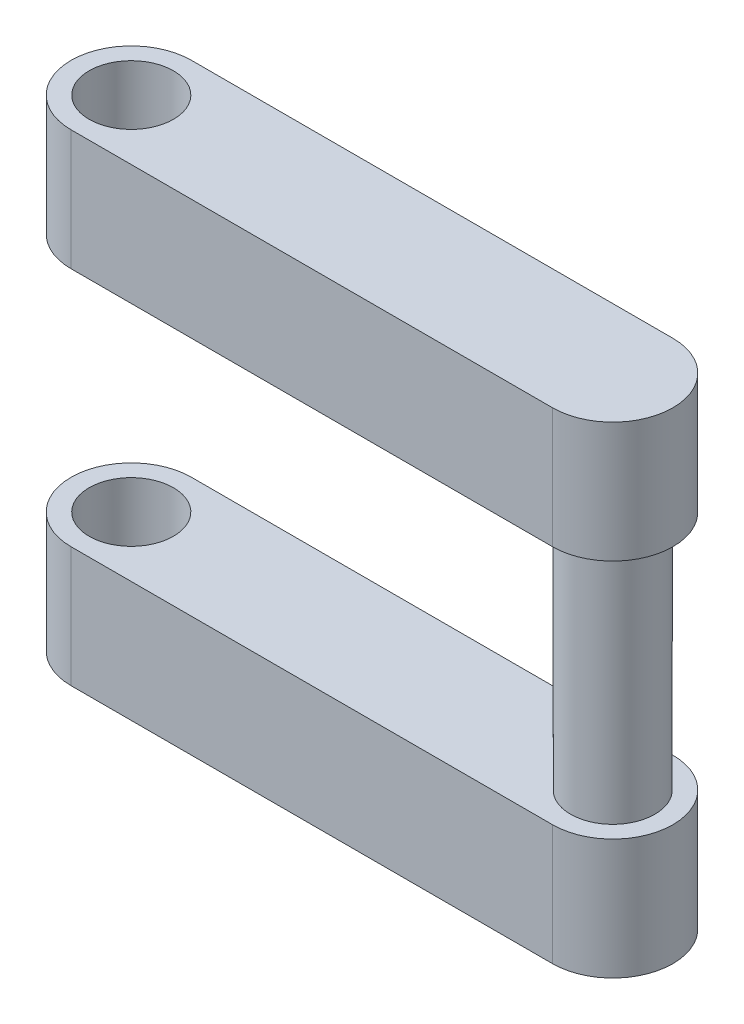
ISO-10303-21;
HEADER;
FILE_DESCRIPTION(('STEP AP214'),'2;1');
FILE_NAME('part.step','',(''),(''),'','','');
FILE_SCHEMA(('AUTOMOTIVE_DESIGN { 1 0 10303 214 1 1 1 1 }'));
ENDSEC;
DATA;
#1=APPLICATION_CONTEXT('core data for automotive mechanical design processes');
#2=APPLICATION_PROTOCOL_DEFINITION('international standard','automotive_design',2000,#1);
#3=PRODUCT_CONTEXT('',#1,'mechanical');
#4=PRODUCT('Part','Part','',(#3));
#5=PRODUCT_RELATED_PRODUCT_CATEGORY('part','',(#4));
#6=PRODUCT_DEFINITION_FORMATION('','',#4);
#7=PRODUCT_DEFINITION_CONTEXT('part definition',#1,'design');
#8=PRODUCT_DEFINITION('design','',#6,#7);
#9=PRODUCT_DEFINITION_SHAPE('','',#8);
#10=(LENGTH_UNIT() NAMED_UNIT(*) SI_UNIT(.MILLI.,.METRE.));
#11=(NAMED_UNIT(*) PLANE_ANGLE_UNIT() SI_UNIT($,.RADIAN.));
#12=(NAMED_UNIT(*) SI_UNIT($,.STERADIAN.) SOLID_ANGLE_UNIT());
#13=UNCERTAINTY_MEASURE_WITH_UNIT(LENGTH_MEASURE(1.E-05),#10,'distance_accuracy_value','');
#14=(GEOMETRIC_REPRESENTATION_CONTEXT(3) GLOBAL_UNCERTAINTY_ASSIGNED_CONTEXT((#13)) GLOBAL_UNIT_ASSIGNED_CONTEXT((#10,
#11,#12)) REPRESENTATION_CONTEXT('',''));
#15=CARTESIAN_POINT('',(0.,0.,0.));
#16=DIRECTION('',(0.,0.,1.));
#17=DIRECTION('',(1.,0.,0.));
#18=AXIS2_PLACEMENT_3D('',#15,#16,#17);
#19=CARTESIAN_POINT('',(-40.,10.,0.));
#20=DIRECTION('',(0.,1.,0.));
#21=DIRECTION('',(0.,0.,1.));
#22=AXIS2_PLACEMENT_3D('',#19,#20,#21);
#23=CYLINDRICAL_SURFACE('',#22,5.);
#24=CARTESIAN_POINT('',(-40.,20.,0.));
#25=DIRECTION('',(0.,1.,0.));
#26=DIRECTION('',(0.,0.,1.));
#27=AXIS2_PLACEMENT_3D('',#24,#25,#26);
#28=CIRCLE('',#27,5.);
#29=CARTESIAN_POINT('',(-40.,20.,-5.));
#30=VERTEX_POINT('',#29);
#31=CARTESIAN_POINT('',(-40.,20.,5.));
#32=VERTEX_POINT('',#31);
#33=EDGE_CURVE('E148',#30,#32,#28,.T.);
#34=ORIENTED_EDGE('',*,*,#33,.F.);
#35=DIRECTION('',(0.,1.,0.));
#36=VECTOR('',#35,1.);
#37=CARTESIAN_POINT('',(-40.,10.,-5.));
#38=LINE('',#37,#36);
#39=CARTESIAN_POINT('',(-40.,10.,-5.));
#40=VERTEX_POINT('',#39);
#41=EDGE_CURVE('E11',#40,#30,#38,.T.);
#42=ORIENTED_EDGE('',*,*,#41,.F.);
#43=CARTESIAN_POINT('',(-40.,10.,0.));
#44=DIRECTION('',(0.,1.,0.));
#45=DIRECTION('',(0.,0.,1.));
#46=AXIS2_PLACEMENT_3D('',#43,#44,#45);
#47=CIRCLE('',#46,5.);
#48=CARTESIAN_POINT('',(-40.,10.,5.));
#49=VERTEX_POINT('',#48);
#50=EDGE_CURVE('E152',#40,#49,#47,.T.);
#51=ORIENTED_EDGE('',*,*,#50,.T.);
#52=DIRECTION('',(0.,1.,0.));
#53=VECTOR('',#52,1.);
#54=CARTESIAN_POINT('',(-40.,10.,5.));
#55=LINE('',#54,#53);
#56=EDGE_CURVE('E77',#49,#32,#55,.T.);
#57=ORIENTED_EDGE('',*,*,#56,.T.);
#58=EDGE_LOOP('',(#34,#42,#51,#57));
#59=FACE_BOUND('',#58,.T.);
#60=ADVANCED_FACE('F32',(#59),#23,.T.);
#61=CARTESIAN_POINT('',(-40.,10.,-5.));
#62=DIRECTION('',(0.,0.,-1.));
#63=DIRECTION('',(-1.,0.,0.));
#64=AXIS2_PLACEMENT_3D('',#61,#62,#63);
#65=PLANE('',#64);
#66=DIRECTION('',(-1.,0.,0.));
#67=VECTOR('',#66,1.);
#68=CARTESIAN_POINT('',(-40.,20.,-5.));
#69=LINE('',#68,#67);
#70=CARTESIAN_POINT('',(0.,20.,-5.));
#71=VERTEX_POINT('',#70);
#72=EDGE_CURVE('E155',#71,#30,#69,.T.);
#73=ORIENTED_EDGE('',*,*,#72,.F.);
#74=DIRECTION('',(0.,1.,0.));
#75=VECTOR('',#74,1.);
#76=CARTESIAN_POINT('',(0.,10.,-5.));
#77=LINE('',#76,#75);
#78=CARTESIAN_POINT('',(0.,10.,-5.));
#79=VERTEX_POINT('',#78);
#80=EDGE_CURVE('E42',#79,#71,#77,.T.);
#81=ORIENTED_EDGE('',*,*,#80,.F.);
#82=DIRECTION('',(-1.,0.,0.));
#83=VECTOR('',#82,1.);
#84=CARTESIAN_POINT('',(-40.,10.,-5.));
#85=LINE('',#84,#83);
#86=EDGE_CURVE('E159',#79,#40,#85,.T.);
#87=ORIENTED_EDGE('',*,*,#86,.T.);
#88=ORIENTED_EDGE('',*,*,#41,.T.);
#89=EDGE_LOOP('',(#73,#81,#87,#88));
#90=FACE_BOUND('',#89,.T.);
#91=ADVANCED_FACE('F175',(#90),#65,.T.);
#92=CARTESIAN_POINT('',(0.,10.,0.));
#93=DIRECTION('',(0.,1.,0.));
#94=DIRECTION('',(0.,0.,1.));
#95=AXIS2_PLACEMENT_3D('',#92,#93,#94);
#96=CYLINDRICAL_SURFACE('',#95,5.);
#97=CARTESIAN_POINT('',(0.,20.,0.));
#98=DIRECTION('',(0.,1.,0.));
#99=DIRECTION('',(0.,0.,1.));
#100=AXIS2_PLACEMENT_3D('',#97,#98,#99);
#101=CIRCLE('',#100,5.);
#102=CARTESIAN_POINT('',(0.,20.,5.));
#103=VERTEX_POINT('',#102);
#104=EDGE_CURVE('E166',#103,#71,#101,.T.);
#105=ORIENTED_EDGE('',*,*,#104,.F.);
#106=DIRECTION('',(0.,1.,0.));
#107=VECTOR('',#106,1.);
#108=CARTESIAN_POINT('',(0.,10.,5.));
#109=LINE('',#108,#107);
#110=CARTESIAN_POINT('',(0.,10.,5.));
#111=VERTEX_POINT('',#110);
#112=EDGE_CURVE('E171',#111,#103,#109,.T.);
#113=ORIENTED_EDGE('',*,*,#112,.F.);
#114=CARTESIAN_POINT('',(0.,10.,0.));
#115=DIRECTION('',(0.,1.,0.));
#116=DIRECTION('',(0.,0.,1.));
#117=AXIS2_PLACEMENT_3D('',#114,#115,#116);
#118=CIRCLE('',#117,5.);
#119=EDGE_CURVE('E157',#111,#79,#118,.T.);
#120=ORIENTED_EDGE('',*,*,#119,.T.);
#121=ORIENTED_EDGE('',*,*,#80,.T.);
#122=EDGE_LOOP('',(#105,#113,#120,#121));
#123=FACE_BOUND('',#122,.T.);
#124=ADVANCED_FACE('F178',(#123),#96,.T.);
#125=CARTESIAN_POINT('',(-40.,10.,5.));
#126=DIRECTION('',(0.,0.,1.));
#127=DIRECTION('',(1.,0.,0.));
#128=AXIS2_PLACEMENT_3D('',#125,#126,#127);
#129=PLANE('',#128);
#130=DIRECTION('',(1.,0.,0.));
#131=VECTOR('',#130,1.);
#132=CARTESIAN_POINT('',(-40.,20.,5.));
#133=LINE('',#132,#131);
#134=EDGE_CURVE('E163',#32,#103,#133,.T.);
#135=ORIENTED_EDGE('',*,*,#134,.F.);
#136=ORIENTED_EDGE('',*,*,#56,.F.);
#137=DIRECTION('',(1.,0.,0.));
#138=VECTOR('',#137,1.);
#139=CARTESIAN_POINT('',(-40.,10.,5.));
#140=LINE('',#139,#138);
#141=EDGE_CURVE('E154',#49,#111,#140,.T.);
#142=ORIENTED_EDGE('',*,*,#141,.T.);
#143=ORIENTED_EDGE('',*,*,#112,.T.);
#144=EDGE_LOOP('',(#135,#136,#142,#143));
#145=FACE_BOUND('',#144,.T.);
#146=ADVANCED_FACE('F172',(#145),#129,.T.);
#147=CARTESIAN_POINT('',(-40.,10.,0.));
#148=DIRECTION('',(0.,1.,0.));
#149=DIRECTION('',(0.,0.,1.));
#150=AXIS2_PLACEMENT_3D('',#147,#148,#149);
#151=PLANE('',#150);
#152=CARTESIAN_POINT('',(0.,10.,0.));
#153=DIRECTION('',(0.,1.,0.));
#154=DIRECTION('',(0.,0.,1.));
#155=AXIS2_PLACEMENT_3D('',#152,#153,#154);
#156=CIRCLE('',#155,3.5);
#157=CARTESIAN_POINT('',(0.,10.,3.5));
#158=VERTEX_POINT('',#157);
#159=EDGE_CURVE('E137',#158,#158,#156,.F.);
#160=ORIENTED_EDGE('',*,*,#159,.F.);
#161=EDGE_LOOP('',(#160));
#162=FACE_BOUND('',#161,.T.);
#163=CARTESIAN_POINT('',(-40.,10.,0.));
#164=DIRECTION('',(0.,1.,0.));
#165=DIRECTION('',(0.,0.,1.));
#166=AXIS2_PLACEMENT_3D('',#163,#164,#165);
#167=CIRCLE('',#166,3.5);
#168=CARTESIAN_POINT('',(-40.,10.,3.5));
#169=VERTEX_POINT('',#168);
#170=EDGE_CURVE('E312',#169,#169,#167,.F.);
#171=ORIENTED_EDGE('',*,*,#170,.F.);
#172=EDGE_LOOP('',(#171));
#173=FACE_BOUND('',#172,.T.);
#174=ORIENTED_EDGE('',*,*,#50,.F.);
#175=ORIENTED_EDGE('',*,*,#86,.F.);
#176=ORIENTED_EDGE('',*,*,#119,.F.);
#177=ORIENTED_EDGE('',*,*,#141,.F.);
#178=EDGE_LOOP('',(#174,#175,#176,#177));
#179=FACE_BOUND('',#178,.T.);
#180=ADVANCED_FACE('F180',(#162,#173,#179),#151,.F.);
#181=CARTESIAN_POINT('',(-40.,20.,0.));
#182=DIRECTION('',(0.,1.,0.));
#183=DIRECTION('',(0.,0.,1.));
#184=AXIS2_PLACEMENT_3D('',#181,#182,#183);
#185=PLANE('',#184);
#186=CARTESIAN_POINT('',(-40.,20.,0.));
#187=DIRECTION('',(0.,1.,0.));
#188=DIRECTION('',(0.,0.,1.));
#189=AXIS2_PLACEMENT_3D('',#186,#187,#188);
#190=CIRCLE('',#189,3.5);
#191=CARTESIAN_POINT('',(-40.,20.,3.5));
#192=VERTEX_POINT('',#191);
#193=EDGE_CURVE('E309',#192,#192,#190,.F.);
#194=ORIENTED_EDGE('',*,*,#193,.T.);
#195=EDGE_LOOP('',(#194));
#196=FACE_BOUND('',#195,.T.);
#197=ORIENTED_EDGE('',*,*,#33,.T.);
#198=ORIENTED_EDGE('',*,*,#134,.T.);
#199=ORIENTED_EDGE('',*,*,#104,.T.);
#200=ORIENTED_EDGE('',*,*,#72,.T.);
#201=EDGE_LOOP('',(#197,#198,#199,#200));
#202=FACE_BOUND('',#201,.T.);
#203=ADVANCED_FACE('F174',(#196,#202),#185,.T.);
#204=CARTESIAN_POINT('',(-40.,-10.,0.));
#205=DIRECTION('',(0.,-1.,0.));
#206=DIRECTION('',(0.,0.,-1.));
#207=AXIS2_PLACEMENT_3D('',#204,#205,#206);
#208=CYLINDRICAL_SURFACE('',#207,5.);
#209=CARTESIAN_POINT('',(-40.,-20.,0.));
#210=DIRECTION('',(0.,-1.,0.));
#211=DIRECTION('',(0.,0.,-1.));
#212=AXIS2_PLACEMENT_3D('',#209,#210,#211);
#213=CIRCLE('',#212,5.);
#214=CARTESIAN_POINT('',(-40.,-20.,5.));
#215=VERTEX_POINT('',#214);
#216=CARTESIAN_POINT('',(-40.,-20.,-5.));
#217=VERTEX_POINT('',#216);
#218=EDGE_CURVE('E142',#215,#217,#213,.T.);
#219=ORIENTED_EDGE('',*,*,#218,.F.);
#220=DIRECTION('',(0.,-1.,0.));
#221=VECTOR('',#220,1.);
#222=CARTESIAN_POINT('',(-40.,-10.,5.));
#223=LINE('',#222,#221);
#224=CARTESIAN_POINT('',(-40.,-10.,5.));
#225=VERTEX_POINT('',#224);
#226=EDGE_CURVE('E130',#225,#215,#223,.T.);
#227=ORIENTED_EDGE('',*,*,#226,.F.);
#228=CARTESIAN_POINT('',(-40.,-10.,0.));
#229=DIRECTION('',(0.,-1.,0.));
#230=DIRECTION('',(0.,0.,-1.));
#231=AXIS2_PLACEMENT_3D('',#228,#229,#230);
#232=CIRCLE('',#231,5.);
#233=CARTESIAN_POINT('',(-40.,-10.,-5.));
#234=VERTEX_POINT('',#233);
#235=EDGE_CURVE('E124',#225,#234,#232,.T.);
#236=ORIENTED_EDGE('',*,*,#235,.T.);
#237=DIRECTION('',(0.,-1.,0.));
#238=VECTOR('',#237,1.);
#239=CARTESIAN_POINT('',(-40.,-10.,-5.));
#240=LINE('',#239,#238);
#241=EDGE_CURVE('E106',#234,#217,#240,.T.);
#242=ORIENTED_EDGE('',*,*,#241,.T.);
#243=EDGE_LOOP('',(#219,#227,#236,#242));
#244=FACE_BOUND('',#243,.T.);
#245=ADVANCED_FACE('F129',(#244),#208,.T.);
#246=CARTESIAN_POINT('',(-40.,-10.,5.));
#247=DIRECTION('',(0.,0.,1.));
#248=DIRECTION('',(1.,0.,0.));
#249=AXIS2_PLACEMENT_3D('',#246,#247,#248);
#250=PLANE('',#249);
#251=DIRECTION('',(-1.,0.,0.));
#252=VECTOR('',#251,1.);
#253=CARTESIAN_POINT('',(-40.,-20.,5.));
#254=LINE('',#253,#252);
#255=CARTESIAN_POINT('',(0.,-20.,5.));
#256=VERTEX_POINT('',#255);
#257=EDGE_CURVE('E131',#256,#215,#254,.T.);
#258=ORIENTED_EDGE('',*,*,#257,.F.);
#259=DIRECTION('',(0.,-1.,0.));
#260=VECTOR('',#259,1.);
#261=CARTESIAN_POINT('',(0.,-10.,5.));
#262=LINE('',#261,#260);
#263=CARTESIAN_POINT('',(0.,-10.,5.));
#264=VERTEX_POINT('',#263);
#265=EDGE_CURVE('E149',#264,#256,#262,.T.);
#266=ORIENTED_EDGE('',*,*,#265,.F.);
#267=DIRECTION('',(-1.,0.,0.));
#268=VECTOR('',#267,1.);
#269=CARTESIAN_POINT('',(-40.,-10.,5.));
#270=LINE('',#269,#268);
#271=EDGE_CURVE('E117',#264,#225,#270,.T.);
#272=ORIENTED_EDGE('',*,*,#271,.T.);
#273=ORIENTED_EDGE('',*,*,#226,.T.);
#274=EDGE_LOOP('',(#258,#266,#272,#273));
#275=FACE_BOUND('',#274,.T.);
#276=ADVANCED_FACE('F219',(#275),#250,.T.);
#277=CARTESIAN_POINT('',(0.,-10.,0.));
#278=DIRECTION('',(0.,-1.,0.));
#279=DIRECTION('',(0.,0.,-1.));
#280=AXIS2_PLACEMENT_3D('',#277,#278,#279);
#281=CYLINDRICAL_SURFACE('',#280,5.);
#282=CARTESIAN_POINT('',(0.,-20.,0.));
#283=DIRECTION('',(0.,-1.,0.));
#284=DIRECTION('',(0.,0.,-1.));
#285=AXIS2_PLACEMENT_3D('',#282,#283,#284);
#286=CIRCLE('',#285,5.);
#287=CARTESIAN_POINT('',(0.,-20.,-5.));
#288=VERTEX_POINT('',#287);
#289=EDGE_CURVE('E134',#288,#256,#286,.T.);
#290=ORIENTED_EDGE('',*,*,#289,.F.);
#291=DIRECTION('',(0.,-1.,0.));
#292=VECTOR('',#291,1.);
#293=CARTESIAN_POINT('',(0.,-10.,-5.));
#294=LINE('',#293,#292);
#295=CARTESIAN_POINT('',(0.,-10.,-5.));
#296=VERTEX_POINT('',#295);
#297=EDGE_CURVE('E116',#296,#288,#294,.T.);
#298=ORIENTED_EDGE('',*,*,#297,.F.);
#299=CARTESIAN_POINT('',(0.,-10.,0.));
#300=DIRECTION('',(0.,-1.,0.));
#301=DIRECTION('',(0.,0.,-1.));
#302=AXIS2_PLACEMENT_3D('',#299,#300,#301);
#303=CIRCLE('',#302,5.);
#304=EDGE_CURVE('E127',#296,#264,#303,.T.);
#305=ORIENTED_EDGE('',*,*,#304,.T.);
#306=ORIENTED_EDGE('',*,*,#265,.T.);
#307=EDGE_LOOP('',(#290,#298,#305,#306));
#308=FACE_BOUND('',#307,.T.);
#309=ADVANCED_FACE('F228',(#308),#281,.T.);
#310=CARTESIAN_POINT('',(-40.,-10.,-5.));
#311=DIRECTION('',(0.,0.,-1.));
#312=DIRECTION('',(-1.,0.,0.));
#313=AXIS2_PLACEMENT_3D('',#310,#311,#312);
#314=PLANE('',#313);
#315=DIRECTION('',(1.,0.,0.));
#316=VECTOR('',#315,1.);
#317=CARTESIAN_POINT('',(-40.,-20.,-5.));
#318=LINE('',#317,#316);
#319=EDGE_CURVE('E111',#217,#288,#318,.T.);
#320=ORIENTED_EDGE('',*,*,#319,.F.);
#321=ORIENTED_EDGE('',*,*,#241,.F.);
#322=DIRECTION('',(1.,0.,0.));
#323=VECTOR('',#322,1.);
#324=CARTESIAN_POINT('',(-40.,-10.,-5.));
#325=LINE('',#324,#323);
#326=EDGE_CURVE('E109',#234,#296,#325,.T.);
#327=ORIENTED_EDGE('',*,*,#326,.T.);
#328=ORIENTED_EDGE('',*,*,#297,.T.);
#329=EDGE_LOOP('',(#320,#321,#327,#328));
#330=FACE_BOUND('',#329,.T.);
#331=ADVANCED_FACE('F108',(#330),#314,.T.);
#332=CARTESIAN_POINT('',(-40.,-10.,0.));
#333=DIRECTION('',(0.,-1.,0.));
#334=DIRECTION('',(0.,0.,-1.));
#335=AXIS2_PLACEMENT_3D('',#332,#333,#334);
#336=PLANE('',#335);
#337=CARTESIAN_POINT('',(0.,-10.,0.));
#338=DIRECTION('',(0.,-1.,0.));
#339=DIRECTION('',(0.,0.,-1.));
#340=AXIS2_PLACEMENT_3D('',#337,#338,#339);
#341=CIRCLE('',#340,3.5);
#342=CARTESIAN_POINT('',(0.,-10.,-3.5));
#343=VERTEX_POINT('',#342);
#344=EDGE_CURVE('E313',#343,#343,#341,.F.);
#345=ORIENTED_EDGE('',*,*,#344,.F.);
#346=EDGE_LOOP('',(#345));
#347=FACE_BOUND('',#346,.T.);
#348=CARTESIAN_POINT('',(-40.,-10.,0.));
#349=DIRECTION('',(0.,-1.,0.));
#350=DIRECTION('',(0.,0.,-1.));
#351=AXIS2_PLACEMENT_3D('',#348,#349,#350);
#352=CIRCLE('',#351,3.5);
#353=CARTESIAN_POINT('',(-40.,-10.,-3.5));
#354=VERTEX_POINT('',#353);
#355=EDGE_CURVE('E316',#354,#354,#352,.F.);
#356=ORIENTED_EDGE('',*,*,#355,.F.);
#357=EDGE_LOOP('',(#356));
#358=FACE_BOUND('',#357,.T.);
#359=ORIENTED_EDGE('',*,*,#235,.F.);
#360=ORIENTED_EDGE('',*,*,#271,.F.);
#361=ORIENTED_EDGE('',*,*,#304,.F.);
#362=ORIENTED_EDGE('',*,*,#326,.F.);
#363=EDGE_LOOP('',(#359,#360,#361,#362));
#364=FACE_BOUND('',#363,.T.);
#365=ADVANCED_FACE('F122',(#347,#358,#364),#336,.F.);
#366=CARTESIAN_POINT('',(-40.,-20.,0.));
#367=DIRECTION('',(0.,1.,0.));
#368=DIRECTION('',(0.,0.,1.));
#369=AXIS2_PLACEMENT_3D('',#366,#367,#368);
#370=PLANE('',#369);
#371=CARTESIAN_POINT('',(-40.,-20.,0.));
#372=DIRECTION('',(0.,1.,0.));
#373=DIRECTION('',(0.,0.,1.));
#374=AXIS2_PLACEMENT_3D('',#371,#372,#373);
#375=CIRCLE('',#374,3.5);
#376=CARTESIAN_POINT('',(-40.,-20.,3.5));
#377=VERTEX_POINT('',#376);
#378=EDGE_CURVE('E36',#377,#377,#375,.F.);
#379=ORIENTED_EDGE('',*,*,#378,.F.);
#380=EDGE_LOOP('',(#379));
#381=FACE_BOUND('',#380,.T.);
#382=ORIENTED_EDGE('',*,*,#218,.T.);
#383=ORIENTED_EDGE('',*,*,#319,.T.);
#384=ORIENTED_EDGE('',*,*,#289,.T.);
#385=ORIENTED_EDGE('',*,*,#257,.T.);
#386=EDGE_LOOP('',(#382,#383,#384,#385));
#387=FACE_BOUND('',#386,.T.);
#388=ADVANCED_FACE('F34',(#381,#387),#370,.F.);
#389=CARTESIAN_POINT('',(0.,-20.,0.));
#390=DIRECTION('',(0.,1.,0.));
#391=DIRECTION('',(0.,0.,1.));
#392=AXIS2_PLACEMENT_3D('',#389,#390,#391);
#393=CYLINDRICAL_SURFACE('',#392,3.5);
#394=ORIENTED_EDGE('',*,*,#344,.T.);
#395=EDGE_LOOP('',(#394));
#396=FACE_BOUND('',#395,.T.);
#397=ORIENTED_EDGE('',*,*,#159,.T.);
#398=EDGE_LOOP('',(#397));
#399=FACE_BOUND('',#398,.T.);
#400=ADVANCED_FACE('F265',(#396,#399),#393,.T.);
#401=CARTESIAN_POINT('',(-40.,23.,0.));
#402=DIRECTION('',(0.,-1.,0.));
#403=DIRECTION('',(0.,0.,-1.));
#404=AXIS2_PLACEMENT_3D('',#401,#402,#403);
#405=CYLINDRICAL_SURFACE('',#404,3.5);
#406=ORIENTED_EDGE('',*,*,#378,.T.);
#407=EDGE_LOOP('',(#406));
#408=FACE_BOUND('',#407,.T.);
#409=ORIENTED_EDGE('',*,*,#355,.T.);
#410=EDGE_LOOP('',(#409));
#411=FACE_BOUND('',#410,.T.);
#412=ADVANCED_FACE('F270',(#408,#411),#405,.F.);
#413=ORIENTED_EDGE('',*,*,#193,.F.);
#414=EDGE_LOOP('',(#413));
#415=FACE_BOUND('',#414,.T.);
#416=ORIENTED_EDGE('',*,*,#170,.T.);
#417=EDGE_LOOP('',(#416));
#418=FACE_BOUND('',#417,.T.);
#419=ADVANCED_FACE('F293',(#415,#418),#405,.F.);
#420=CLOSED_SHELL('',(#60,#91,#124,#146,#180,#203,#245,#276,#309,#331,#365,#388,#400,#412,#419));
#421=MANIFOLD_SOLID_BREP('B2',#420);
#422=ADVANCED_BREP_SHAPE_REPRESENTATION('',(#18,#421),#14);
#423=SHAPE_DEFINITION_REPRESENTATION(#9,#422);
ENDSEC;
END-ISO-10303-21;
